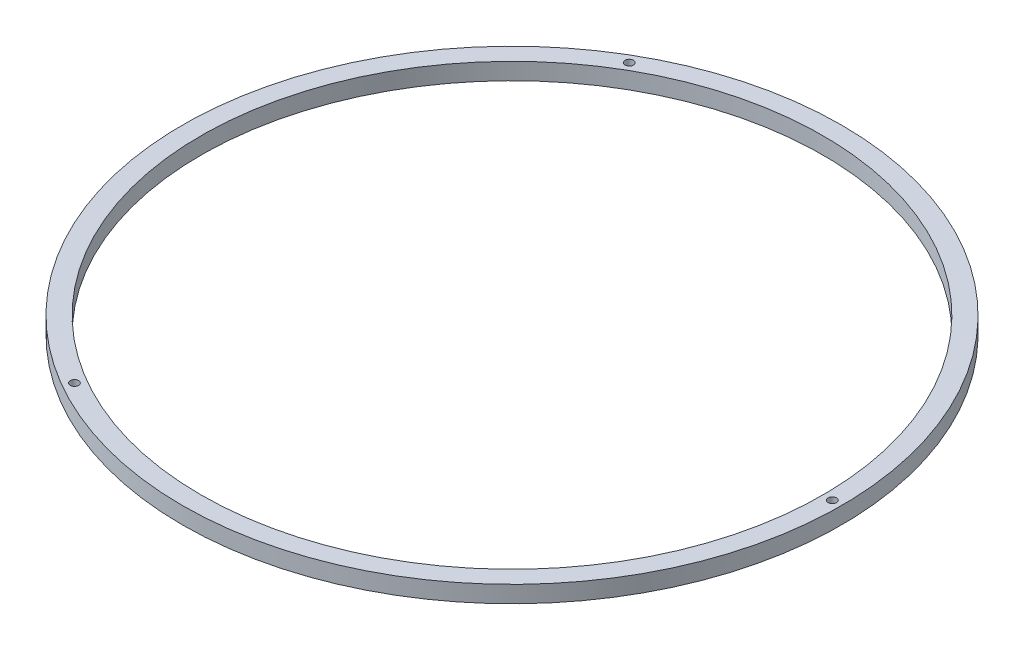
ISO-10303-21;
HEADER;
FILE_DESCRIPTION(('STEP AP214'),'2;1');
FILE_NAME('part.step','',(''),(''),'','','');
FILE_SCHEMA(('AUTOMOTIVE_DESIGN { 1 0 10303 214 1 1 1 1 }'));
ENDSEC;
DATA;
#1=APPLICATION_CONTEXT('core data for automotive mechanical design processes');
#2=APPLICATION_PROTOCOL_DEFINITION('international standard','automotive_design',2000,#1);
#3=PRODUCT_CONTEXT('',#1,'mechanical');
#4=PRODUCT('Part','Part','',(#3));
#5=PRODUCT_RELATED_PRODUCT_CATEGORY('part','',(#4));
#6=PRODUCT_DEFINITION_FORMATION('','',#4);
#7=PRODUCT_DEFINITION_CONTEXT('part definition',#1,'design');
#8=PRODUCT_DEFINITION('design','',#6,#7);
#9=PRODUCT_DEFINITION_SHAPE('','',#8);
#10=(LENGTH_UNIT() NAMED_UNIT(*) SI_UNIT(.MILLI.,.METRE.));
#11=(NAMED_UNIT(*) PLANE_ANGLE_UNIT() SI_UNIT($,.RADIAN.));
#12=(NAMED_UNIT(*) SI_UNIT($,.STERADIAN.) SOLID_ANGLE_UNIT());
#13=UNCERTAINTY_MEASURE_WITH_UNIT(LENGTH_MEASURE(1.E-05),#10,'distance_accuracy_value','');
#14=(GEOMETRIC_REPRESENTATION_CONTEXT(3) GLOBAL_UNCERTAINTY_ASSIGNED_CONTEXT((#13)) GLOBAL_UNIT_ASSIGNED_CONTEXT((#10,
#11,#12)) REPRESENTATION_CONTEXT('',''));
#15=CARTESIAN_POINT('',(0.,0.,0.));
#16=DIRECTION('',(0.,0.,1.));
#17=DIRECTION('',(1.,0.,0.));
#18=AXIS2_PLACEMENT_3D('',#15,#16,#17);
#19=CARTESIAN_POINT('',(0.,10.,0.));
#20=DIRECTION('',(0.,1.,0.));
#21=DIRECTION('',(0.,0.,1.));
#22=AXIS2_PLACEMENT_3D('',#19,#20,#21);
#23=PLANE('',#22);
#24=CARTESIAN_POINT('',(190.525588832576,10.,0.));
#25=DIRECTION('',(0.,1.,0.));
#26=DIRECTION('',(0.,0.,1.));
#27=AXIS2_PLACEMENT_3D('',#24,#25,#26);
#28=CIRCLE('',#27,2.5);
#29=CARTESIAN_POINT('',(190.525588832576,10.,2.5));
#30=VERTEX_POINT('',#29);
#31=EDGE_CURVE('E64',#30,#30,#28,.T.);
#32=ORIENTED_EDGE('',*,*,#31,.F.);
#33=EDGE_LOOP('',(#32));
#34=FACE_BOUND('',#33,.T.);
#35=CARTESIAN_POINT('',(0.,10.,0.));
#36=DIRECTION('',(0.,1.,0.));
#37=DIRECTION('',(0.,0.,1.));
#38=AXIS2_PLACEMENT_3D('',#35,#36,#37);
#39=CIRCLE('',#38,185.);
#40=CARTESIAN_POINT('',(0.,10.,185.));
#41=VERTEX_POINT('',#40);
#42=EDGE_CURVE('E50',#41,#41,#39,.T.);
#43=ORIENTED_EDGE('',*,*,#42,.F.);
#44=EDGE_LOOP('',(#43));
#45=FACE_BOUND('',#44,.T.);
#46=CARTESIAN_POINT('',(0.,10.,0.));
#47=DIRECTION('',(0.,1.,0.));
#48=DIRECTION('',(0.,0.,1.));
#49=AXIS2_PLACEMENT_3D('',#46,#47,#48);
#50=CIRCLE('',#49,196.);
#51=CARTESIAN_POINT('',(0.,10.,196.));
#52=VERTEX_POINT('',#51);
#53=EDGE_CURVE('E10',#52,#52,#50,.T.);
#54=ORIENTED_EDGE('',*,*,#53,.T.);
#55=EDGE_LOOP('',(#54));
#56=FACE_BOUND('',#55,.T.);
#57=CARTESIAN_POINT('',(-95.2627944162889,10.,-164.999999999999));
#58=DIRECTION('',(0.,1.,0.));
#59=DIRECTION('',(0.,0.,1.));
#60=AXIS2_PLACEMENT_3D('',#57,#58,#59);
#61=CIRCLE('',#60,2.5);
#62=CARTESIAN_POINT('',(-95.2627944162889,10.,-162.499999999999));
#63=VERTEX_POINT('',#62);
#64=EDGE_CURVE('E56',#63,#63,#61,.T.);
#65=ORIENTED_EDGE('',*,*,#64,.F.);
#66=EDGE_LOOP('',(#65));
#67=FACE_BOUND('',#66,.T.);
#68=CARTESIAN_POINT('',(-95.2627944162866,10.,165.000000000001));
#69=DIRECTION('',(0.,1.,0.));
#70=DIRECTION('',(0.,0.,1.));
#71=AXIS2_PLACEMENT_3D('',#68,#69,#70);
#72=CIRCLE('',#71,2.5);
#73=CARTESIAN_POINT('',(-95.2627944162866,10.,167.500000000001));
#74=VERTEX_POINT('',#73);
#75=EDGE_CURVE('E72',#74,#74,#72,.T.);
#76=ORIENTED_EDGE('',*,*,#75,.F.);
#77=EDGE_LOOP('',(#76));
#78=FACE_BOUND('',#77,.T.);
#79=ADVANCED_FACE('F37',(#34,#45,#56,#67,#78),#23,.T.);
#80=CARTESIAN_POINT('',(0.,0.,0.));
#81=DIRECTION('',(0.,1.,0.));
#82=DIRECTION('',(0.,0.,1.));
#83=AXIS2_PLACEMENT_3D('',#80,#81,#82);
#84=PLANE('',#83);
#85=CARTESIAN_POINT('',(0.,0.,0.));
#86=DIRECTION('',(0.,1.,0.));
#87=DIRECTION('',(0.,0.,1.));
#88=AXIS2_PLACEMENT_3D('',#85,#86,#87);
#89=CIRCLE('',#88,196.);
#90=CARTESIAN_POINT('',(0.,0.,196.));
#91=VERTEX_POINT('',#90);
#92=EDGE_CURVE('E41',#91,#91,#89,.T.);
#93=ORIENTED_EDGE('',*,*,#92,.F.);
#94=EDGE_LOOP('',(#93));
#95=FACE_BOUND('',#94,.T.);
#96=CARTESIAN_POINT('',(0.,0.,0.));
#97=DIRECTION('',(0.,1.,0.));
#98=DIRECTION('',(0.,0.,1.));
#99=AXIS2_PLACEMENT_3D('',#96,#97,#98);
#100=CIRCLE('',#99,185.);
#101=CARTESIAN_POINT('',(0.,0.,185.));
#102=VERTEX_POINT('',#101);
#103=EDGE_CURVE('E52',#102,#102,#100,.T.);
#104=ORIENTED_EDGE('',*,*,#103,.T.);
#105=EDGE_LOOP('',(#104));
#106=FACE_BOUND('',#105,.T.);
#107=CARTESIAN_POINT('',(-95.2627944162889,0.,-164.999999999999));
#108=DIRECTION('',(0.,1.,0.));
#109=DIRECTION('',(0.,0.,1.));
#110=AXIS2_PLACEMENT_3D('',#107,#108,#109);
#111=CIRCLE('',#110,2.5);
#112=CARTESIAN_POINT('',(-95.2627944162889,0.,-162.499999999999));
#113=VERTEX_POINT('',#112);
#114=EDGE_CURVE('E60',#113,#113,#111,.T.);
#115=ORIENTED_EDGE('',*,*,#114,.T.);
#116=EDGE_LOOP('',(#115));
#117=FACE_BOUND('',#116,.T.);
#118=CARTESIAN_POINT('',(190.525588832576,0.,0.));
#119=DIRECTION('',(0.,1.,0.));
#120=DIRECTION('',(0.,0.,1.));
#121=AXIS2_PLACEMENT_3D('',#118,#119,#120);
#122=CIRCLE('',#121,2.5);
#123=CARTESIAN_POINT('',(190.525588832576,0.,2.5));
#124=VERTEX_POINT('',#123);
#125=EDGE_CURVE('E68',#124,#124,#122,.T.);
#126=ORIENTED_EDGE('',*,*,#125,.T.);
#127=EDGE_LOOP('',(#126));
#128=FACE_BOUND('',#127,.T.);
#129=CARTESIAN_POINT('',(-95.2627944162866,0.,165.000000000001));
#130=DIRECTION('',(0.,1.,0.));
#131=DIRECTION('',(0.,0.,1.));
#132=AXIS2_PLACEMENT_3D('',#129,#130,#131);
#133=CIRCLE('',#132,2.5);
#134=CARTESIAN_POINT('',(-95.2627944162866,0.,167.500000000001));
#135=VERTEX_POINT('',#134);
#136=EDGE_CURVE('E76',#135,#135,#133,.T.);
#137=ORIENTED_EDGE('',*,*,#136,.T.);
#138=EDGE_LOOP('',(#137));
#139=FACE_BOUND('',#138,.T.);
#140=ADVANCED_FACE('F88',(#95,#106,#117,#128,#139),#84,.F.);
#141=CARTESIAN_POINT('',(0.,10.,0.));
#142=DIRECTION('',(0.,-1.,0.));
#143=DIRECTION('',(0.,0.,-1.));
#144=AXIS2_PLACEMENT_3D('',#141,#142,#143);
#145=CYLINDRICAL_SURFACE('',#144,196.);
#146=ORIENTED_EDGE('',*,*,#53,.F.);
#147=EDGE_LOOP('',(#146));
#148=FACE_BOUND('',#147,.T.);
#149=ORIENTED_EDGE('',*,*,#92,.T.);
#150=EDGE_LOOP('',(#149));
#151=FACE_BOUND('',#150,.T.);
#152=ADVANCED_FACE('F39',(#148,#151),#145,.T.);
#153=CARTESIAN_POINT('',(0.,10.,0.));
#154=DIRECTION('',(0.,-1.,0.));
#155=DIRECTION('',(0.,0.,-1.));
#156=AXIS2_PLACEMENT_3D('',#153,#154,#155);
#157=CYLINDRICAL_SURFACE('',#156,185.);
#158=ORIENTED_EDGE('',*,*,#42,.T.);
#159=EDGE_LOOP('',(#158));
#160=FACE_BOUND('',#159,.T.);
#161=ORIENTED_EDGE('',*,*,#103,.F.);
#162=EDGE_LOOP('',(#161));
#163=FACE_BOUND('',#162,.T.);
#164=ADVANCED_FACE('F98',(#160,#163),#157,.F.);
#165=CARTESIAN_POINT('',(-95.2627944162889,10.,-164.999999999999));
#166=DIRECTION('',(0.,-1.,0.));
#167=DIRECTION('',(0.,0.,-1.));
#168=AXIS2_PLACEMENT_3D('',#165,#166,#167);
#169=CYLINDRICAL_SURFACE('',#168,2.5);
#170=ORIENTED_EDGE('',*,*,#64,.T.);
#171=EDGE_LOOP('',(#170));
#172=FACE_BOUND('',#171,.T.);
#173=ORIENTED_EDGE('',*,*,#114,.F.);
#174=EDGE_LOOP('',(#173));
#175=FACE_BOUND('',#174,.T.);
#176=ADVANCED_FACE('F101',(#172,#175),#169,.F.);
#177=CARTESIAN_POINT('',(190.525588832576,10.,0.));
#178=DIRECTION('',(0.,-1.,0.));
#179=DIRECTION('',(0.,0.,-1.));
#180=AXIS2_PLACEMENT_3D('',#177,#178,#179);
#181=CYLINDRICAL_SURFACE('',#180,2.5);
#182=ORIENTED_EDGE('',*,*,#31,.T.);
#183=EDGE_LOOP('',(#182));
#184=FACE_BOUND('',#183,.T.);
#185=ORIENTED_EDGE('',*,*,#125,.F.);
#186=EDGE_LOOP('',(#185));
#187=FACE_BOUND('',#186,.T.);
#188=ADVANCED_FACE('F105',(#184,#187),#181,.F.);
#189=CARTESIAN_POINT('',(-95.2627944162866,10.,165.000000000001));
#190=DIRECTION('',(0.,-1.,0.));
#191=DIRECTION('',(0.,0.,-1.));
#192=AXIS2_PLACEMENT_3D('',#189,#190,#191);
#193=CYLINDRICAL_SURFACE('',#192,2.5);
#194=ORIENTED_EDGE('',*,*,#75,.T.);
#195=EDGE_LOOP('',(#194));
#196=FACE_BOUND('',#195,.T.);
#197=ORIENTED_EDGE('',*,*,#136,.F.);
#198=EDGE_LOOP('',(#197));
#199=FACE_BOUND('',#198,.T.);
#200=ADVANCED_FACE('F84',(#196,#199),#193,.F.);
#201=CLOSED_SHELL('',(#79,#140,#152,#164,#176,#188,#200));
#202=MANIFOLD_SOLID_BREP('B2',#201);
#203=ADVANCED_BREP_SHAPE_REPRESENTATION('',(#18,#202),#14);
#204=SHAPE_DEFINITION_REPRESENTATION(#9,#203);
ENDSEC;
END-ISO-10303-21;
